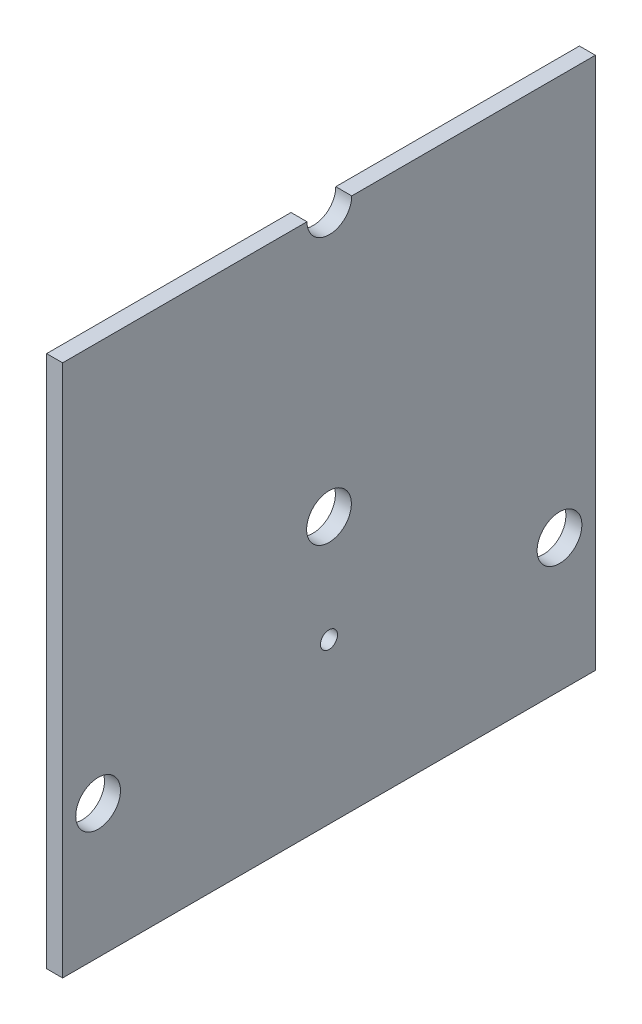
ISO-10303-21;
HEADER;
FILE_DESCRIPTION(('STEP AP214'),'2;1');
FILE_NAME('part.step','',(''),(''),'','','');
FILE_SCHEMA(('AUTOMOTIVE_DESIGN { 1 0 10303 214 1 1 1 1 }'));
ENDSEC;
DATA;
#1=APPLICATION_CONTEXT('core data for automotive mechanical design processes');
#2=APPLICATION_PROTOCOL_DEFINITION('international standard','automotive_design',2000,#1);
#3=PRODUCT_CONTEXT('',#1,'mechanical');
#4=PRODUCT('Part','Part','',(#3));
#5=PRODUCT_RELATED_PRODUCT_CATEGORY('part','',(#4));
#6=PRODUCT_DEFINITION_FORMATION('','',#4);
#7=PRODUCT_DEFINITION_CONTEXT('part definition',#1,'design');
#8=PRODUCT_DEFINITION('design','',#6,#7);
#9=PRODUCT_DEFINITION_SHAPE('','',#8);
#10=(LENGTH_UNIT() NAMED_UNIT(*) SI_UNIT(.MILLI.,.METRE.));
#11=(NAMED_UNIT(*) PLANE_ANGLE_UNIT() SI_UNIT($,.RADIAN.));
#12=(NAMED_UNIT(*) SI_UNIT($,.STERADIAN.) SOLID_ANGLE_UNIT());
#13=UNCERTAINTY_MEASURE_WITH_UNIT(LENGTH_MEASURE(1.E-05),#10,'distance_accuracy_value','');
#14=(GEOMETRIC_REPRESENTATION_CONTEXT(3) GLOBAL_UNCERTAINTY_ASSIGNED_CONTEXT((#13)) GLOBAL_UNIT_ASSIGNED_CONTEXT((#10,
#11,#12)) REPRESENTATION_CONTEXT('',''));
#15=CARTESIAN_POINT('',(0.,0.,0.));
#16=DIRECTION('',(0.,0.,1.));
#17=DIRECTION('',(1.,0.,0.));
#18=AXIS2_PLACEMENT_3D('',#15,#16,#17);
#19=CARTESIAN_POINT('',(3.,50.,50.));
#20=DIRECTION('',(0.,-1.,0.));
#21=DIRECTION('',(0.,0.,-1.));
#22=AXIS2_PLACEMENT_3D('',#19,#20,#21);
#23=PLANE('',#22);
#24=DIRECTION('',(0.,0.,1.));
#25=VECTOR('',#24,1.);
#26=CARTESIAN_POINT('',(3.,50.,50.));
#27=LINE('',#26,#25);
#28=CARTESIAN_POINT('',(3.,50.,4.12849793611253));
#29=VERTEX_POINT('',#28);
#30=CARTESIAN_POINT('',(3.,50.,50.));
#31=VERTEX_POINT('',#30);
#32=EDGE_CURVE('E56',#29,#31,#27,.T.);
#33=ORIENTED_EDGE('',*,*,#32,.F.);
#34=DIRECTION('',(-1.,0.,0.));
#35=VECTOR('',#34,1.);
#36=CARTESIAN_POINT('',(10.,50.,4.12849793611253));
#37=LINE('',#36,#35);
#38=CARTESIAN_POINT('',(0.,50.,4.12849793611253));
#39=VERTEX_POINT('',#38);
#40=EDGE_CURVE('E11',#29,#39,#37,.T.);
#41=ORIENTED_EDGE('',*,*,#40,.T.);
#42=DIRECTION('',(0.,0.,1.));
#43=VECTOR('',#42,1.);
#44=CARTESIAN_POINT('',(0.,50.,50.));
#45=LINE('',#44,#43);
#46=CARTESIAN_POINT('',(0.,50.,50.));
#47=VERTEX_POINT('',#46);
#48=EDGE_CURVE('E77',#39,#47,#45,.T.);
#49=ORIENTED_EDGE('',*,*,#48,.T.);
#50=DIRECTION('',(-1.,0.,0.));
#51=VECTOR('',#50,1.);
#52=CARTESIAN_POINT('',(3.,50.,50.));
#53=LINE('',#52,#51);
#54=EDGE_CURVE('E114',#31,#47,#53,.T.);
#55=ORIENTED_EDGE('',*,*,#54,.F.);
#56=EDGE_LOOP('',(#33,#41,#49,#55));
#57=FACE_BOUND('',#56,.T.);
#58=ADVANCED_FACE('F33',(#57),#23,.F.);
#59=CARTESIAN_POINT('',(3.,0.,0.));
#60=DIRECTION('',(1.,0.,0.));
#61=DIRECTION('',(0.,0.,-1.));
#62=AXIS2_PLACEMENT_3D('',#59,#60,#61);
#63=PLANE('',#62);
#64=CARTESIAN_POINT('',(3.,-20.,0.));
#65=DIRECTION('',(1.,0.,0.));
#66=DIRECTION('',(0.,0.,-1.));
#67=AXIS2_PLACEMENT_3D('',#64,#65,#66);
#68=CIRCLE('',#67,1.6);
#69=CARTESIAN_POINT('',(3.,-20.,-1.6));
#70=VERTEX_POINT('',#69);
#71=EDGE_CURVE('E99',#70,#70,#68,.T.);
#72=ORIENTED_EDGE('',*,*,#71,.F.);
#73=EDGE_LOOP('',(#72));
#74=FACE_BOUND('',#73,.T.);
#75=CARTESIAN_POINT('',(3.,-25.0618970407415,-43.2654748814718));
#76=DIRECTION('',(1.,0.,0.));
#77=DIRECTION('',(0.,0.,-1.));
#78=AXIS2_PLACEMENT_3D('',#75,#76,#77);
#79=CIRCLE('',#78,4.2);
#80=CARTESIAN_POINT('',(3.,-25.0618970407415,-47.4654748814718));
#81=VERTEX_POINT('',#80);
#82=EDGE_CURVE('E156',#81,#81,#79,.T.);
#83=ORIENTED_EDGE('',*,*,#82,.F.);
#84=EDGE_LOOP('',(#83));
#85=FACE_BOUND('',#84,.T.);
#86=CARTESIAN_POINT('',(3.,49.9999488745229,-0.0715020635763067));
#87=DIRECTION('',(1.,0.,0.));
#88=DIRECTION('',(0.,0.,-1.));
#89=AXIS2_PLACEMENT_3D('',#86,#87,#88);
#90=CIRCLE('',#89,4.2);
#91=CARTESIAN_POINT('',(3.,50.,-4.27150206326514));
#92=VERTEX_POINT('',#91);
#93=EDGE_CURVE('E48',#29,#92,#90,.T.);
#94=ORIENTED_EDGE('',*,*,#93,.F.);
#95=ORIENTED_EDGE('',*,*,#32,.T.);
#96=DIRECTION('',(0.,-1.,0.));
#97=VECTOR('',#96,1.);
#98=CARTESIAN_POINT('',(3.,50.,50.));
#99=LINE('',#98,#97);
#100=CARTESIAN_POINT('',(3.,-50.,50.));
#101=VERTEX_POINT('',#100);
#102=EDGE_CURVE('E109',#31,#101,#99,.T.);
#103=ORIENTED_EDGE('',*,*,#102,.T.);
#104=DIRECTION('',(0.,0.,-1.));
#105=VECTOR('',#104,1.);
#106=CARTESIAN_POINT('',(3.,-50.,50.));
#107=LINE('',#106,#105);
#108=CARTESIAN_POINT('',(3.,-50.,-50.));
#109=VERTEX_POINT('',#108);
#110=EDGE_CURVE('E85',#101,#109,#107,.T.);
#111=ORIENTED_EDGE('',*,*,#110,.T.);
#112=DIRECTION('',(0.,1.,0.));
#113=VECTOR('',#112,1.);
#114=CARTESIAN_POINT('',(3.,50.,-50.));
#115=LINE('',#114,#113);
#116=CARTESIAN_POINT('',(3.,50.,-50.));
#117=VERTEX_POINT('',#116);
#118=EDGE_CURVE('E131',#109,#117,#115,.T.);
#119=ORIENTED_EDGE('',*,*,#118,.T.);
#120=EDGE_CURVE('E117',#117,#92,#27,.T.);
#121=ORIENTED_EDGE('',*,*,#120,.T.);
#122=EDGE_LOOP('',(#94,#95,#103,#111,#119,#121));
#123=FACE_BOUND('',#122,.T.);
#124=CARTESIAN_POINT('',(3.,-24.9380518337814,43.3369769450481));
#125=DIRECTION('',(1.,0.,0.));
#126=DIRECTION('',(0.,0.,-1.));
#127=AXIS2_PLACEMENT_3D('',#124,#125,#126);
#128=CIRCLE('',#127,4.2);
#129=CARTESIAN_POINT('',(3.,-24.9380518337814,39.1369769450481));
#130=VERTEX_POINT('',#129);
#131=EDGE_CURVE('E148',#130,#130,#128,.T.);
#132=ORIENTED_EDGE('',*,*,#131,.F.);
#133=EDGE_LOOP('',(#132));
#134=FACE_BOUND('',#133,.T.);
#135=CARTESIAN_POINT('',(3.,0.,0.));
#136=DIRECTION('',(1.,0.,0.));
#137=DIRECTION('',(0.,0.,-1.));
#138=AXIS2_PLACEMENT_3D('',#135,#136,#137);
#139=CIRCLE('',#138,4.2);
#140=CARTESIAN_POINT('',(3.,0.,-4.2));
#141=VERTEX_POINT('',#140);
#142=EDGE_CURVE('E137',#141,#141,#139,.T.);
#143=ORIENTED_EDGE('',*,*,#142,.F.);
#144=EDGE_LOOP('',(#143));
#145=FACE_BOUND('',#144,.T.);
#146=ADVANCED_FACE('F128',(#74,#85,#123,#134,#145),#63,.T.);
#147=CARTESIAN_POINT('',(0.,0.,0.));
#148=DIRECTION('',(1.,0.,0.));
#149=DIRECTION('',(0.,0.,-1.));
#150=AXIS2_PLACEMENT_3D('',#147,#148,#149);
#151=PLANE('',#150);
#152=CARTESIAN_POINT('',(0.,-20.,0.));
#153=DIRECTION('',(-1.,0.,0.));
#154=DIRECTION('',(0.,0.,1.));
#155=AXIS2_PLACEMENT_3D('',#152,#153,#154);
#156=CIRCLE('',#155,1.6);
#157=CARTESIAN_POINT('',(0.,-20.,1.6));
#158=VERTEX_POINT('',#157);
#159=EDGE_CURVE('E164',#158,#158,#156,.T.);
#160=ORIENTED_EDGE('',*,*,#159,.F.);
#161=EDGE_LOOP('',(#160));
#162=FACE_BOUND('',#161,.T.);
#163=CARTESIAN_POINT('',(0.,-25.0618970407415,-43.2654748814718));
#164=DIRECTION('',(-1.,0.,0.));
#165=DIRECTION('',(0.,0.,1.));
#166=AXIS2_PLACEMENT_3D('',#163,#164,#165);
#167=CIRCLE('',#166,4.2);
#168=CARTESIAN_POINT('',(0.,-25.0618970407415,-39.0654748814718));
#169=VERTEX_POINT('',#168);
#170=EDGE_CURVE('E98',#169,#169,#167,.T.);
#171=ORIENTED_EDGE('',*,*,#170,.F.);
#172=EDGE_LOOP('',(#171));
#173=FACE_BOUND('',#172,.T.);
#174=CARTESIAN_POINT('',(0.,-24.9380518337814,43.3369769450481));
#175=DIRECTION('',(-1.,0.,0.));
#176=DIRECTION('',(0.,0.,1.));
#177=AXIS2_PLACEMENT_3D('',#174,#175,#176);
#178=CIRCLE('',#177,4.2);
#179=CARTESIAN_POINT('',(0.,-24.9380518337814,47.5369769450481));
#180=VERTEX_POINT('',#179);
#181=EDGE_CURVE('E153',#180,#180,#178,.T.);
#182=ORIENTED_EDGE('',*,*,#181,.F.);
#183=EDGE_LOOP('',(#182));
#184=FACE_BOUND('',#183,.T.);
#185=ORIENTED_EDGE('',*,*,#48,.F.);
#186=CARTESIAN_POINT('',(0.,49.9999488745229,-0.0715020635763067));
#187=DIRECTION('',(-1.,0.,0.));
#188=DIRECTION('',(0.,0.,1.));
#189=AXIS2_PLACEMENT_3D('',#186,#187,#188);
#190=CIRCLE('',#189,4.2);
#191=CARTESIAN_POINT('',(0.,50.,-4.27150206326514));
#192=VERTEX_POINT('',#191);
#193=EDGE_CURVE('E93',#192,#39,#190,.T.);
#194=ORIENTED_EDGE('',*,*,#193,.F.);
#195=CARTESIAN_POINT('',(0.,50.,-50.));
#196=VERTEX_POINT('',#195);
#197=EDGE_CURVE('E106',#196,#192,#45,.T.);
#198=ORIENTED_EDGE('',*,*,#197,.F.);
#199=DIRECTION('',(0.,1.,0.));
#200=VECTOR('',#199,1.);
#201=CARTESIAN_POINT('',(0.,50.,-50.));
#202=LINE('',#201,#200);
#203=CARTESIAN_POINT('',(0.,-50.,-50.));
#204=VERTEX_POINT('',#203);
#205=EDGE_CURVE('E107',#204,#196,#202,.T.);
#206=ORIENTED_EDGE('',*,*,#205,.F.);
#207=DIRECTION('',(0.,0.,-1.));
#208=VECTOR('',#207,1.);
#209=CARTESIAN_POINT('',(0.,-50.,50.));
#210=LINE('',#209,#208);
#211=CARTESIAN_POINT('',(0.,-50.,50.));
#212=VERTEX_POINT('',#211);
#213=EDGE_CURVE('E110',#212,#204,#210,.T.);
#214=ORIENTED_EDGE('',*,*,#213,.F.);
#215=DIRECTION('',(0.,-1.,0.));
#216=VECTOR('',#215,1.);
#217=CARTESIAN_POINT('',(0.,50.,50.));
#218=LINE('',#217,#216);
#219=EDGE_CURVE('E105',#47,#212,#218,.T.);
#220=ORIENTED_EDGE('',*,*,#219,.F.);
#221=EDGE_LOOP('',(#185,#194,#198,#206,#214,#220));
#222=FACE_BOUND('',#221,.T.);
#223=CARTESIAN_POINT('',(0.,0.,0.));
#224=DIRECTION('',(1.,0.,0.));
#225=DIRECTION('',(0.,0.,-1.));
#226=AXIS2_PLACEMENT_3D('',#223,#224,#225);
#227=CIRCLE('',#226,4.2);
#228=CARTESIAN_POINT('',(0.,0.,-4.2));
#229=VERTEX_POINT('',#228);
#230=EDGE_CURVE('E145',#229,#229,#227,.T.);
#231=ORIENTED_EDGE('',*,*,#230,.T.);
#232=EDGE_LOOP('',(#231));
#233=FACE_BOUND('',#232,.T.);
#234=ADVANCED_FACE('F102',(#162,#173,#184,#222,#233),#151,.F.);
#235=CARTESIAN_POINT('',(3.,50.,50.));
#236=DIRECTION('',(0.,0.,-1.));
#237=DIRECTION('',(-1.,0.,0.));
#238=AXIS2_PLACEMENT_3D('',#235,#236,#237);
#239=PLANE('',#238);
#240=ORIENTED_EDGE('',*,*,#219,.T.);
#241=DIRECTION('',(-1.,0.,0.));
#242=VECTOR('',#241,1.);
#243=CARTESIAN_POINT('',(3.,-50.,50.));
#244=LINE('',#243,#242);
#245=EDGE_CURVE('E123',#101,#212,#244,.T.);
#246=ORIENTED_EDGE('',*,*,#245,.F.);
#247=ORIENTED_EDGE('',*,*,#102,.F.);
#248=ORIENTED_EDGE('',*,*,#54,.T.);
#249=EDGE_LOOP('',(#240,#246,#247,#248));
#250=FACE_BOUND('',#249,.T.);
#251=ADVANCED_FACE('F35',(#250),#239,.F.);
#252=CARTESIAN_POINT('',(3.,-50.,50.));
#253=DIRECTION('',(0.,1.,0.));
#254=DIRECTION('',(0.,0.,1.));
#255=AXIS2_PLACEMENT_3D('',#252,#253,#254);
#256=PLANE('',#255);
#257=ORIENTED_EDGE('',*,*,#213,.T.);
#258=DIRECTION('',(-1.,0.,0.));
#259=VECTOR('',#258,1.);
#260=CARTESIAN_POINT('',(3.,-50.,-50.));
#261=LINE('',#260,#259);
#262=EDGE_CURVE('E120',#109,#204,#261,.T.);
#263=ORIENTED_EDGE('',*,*,#262,.F.);
#264=ORIENTED_EDGE('',*,*,#110,.F.);
#265=ORIENTED_EDGE('',*,*,#245,.T.);
#266=EDGE_LOOP('',(#257,#263,#264,#265));
#267=FACE_BOUND('',#266,.T.);
#268=ADVANCED_FACE('F138',(#267),#256,.F.);
#269=CARTESIAN_POINT('',(3.,50.,-50.));
#270=DIRECTION('',(0.,0.,1.));
#271=DIRECTION('',(1.,0.,0.));
#272=AXIS2_PLACEMENT_3D('',#269,#270,#271);
#273=PLANE('',#272);
#274=ORIENTED_EDGE('',*,*,#205,.T.);
#275=DIRECTION('',(-1.,0.,0.));
#276=VECTOR('',#275,1.);
#277=CARTESIAN_POINT('',(3.,50.,-50.));
#278=LINE('',#277,#276);
#279=EDGE_CURVE('E116',#117,#196,#278,.T.);
#280=ORIENTED_EDGE('',*,*,#279,.F.);
#281=ORIENTED_EDGE('',*,*,#118,.F.);
#282=ORIENTED_EDGE('',*,*,#262,.T.);
#283=EDGE_LOOP('',(#274,#280,#281,#282));
#284=FACE_BOUND('',#283,.T.);
#285=ADVANCED_FACE('F142',(#284),#273,.F.);
#286=ORIENTED_EDGE('',*,*,#197,.T.);
#287=DIRECTION('',(-1.,0.,0.));
#288=VECTOR('',#287,1.);
#289=CARTESIAN_POINT('',(10.,50.,-4.27150206326514));
#290=LINE('',#289,#288);
#291=EDGE_CURVE('E41',#192,#92,#290,.F.);
#292=ORIENTED_EDGE('',*,*,#291,.T.);
#293=ORIENTED_EDGE('',*,*,#120,.F.);
#294=ORIENTED_EDGE('',*,*,#279,.T.);
#295=EDGE_LOOP('',(#286,#292,#293,#294));
#296=FACE_BOUND('',#295,.T.);
#297=ADVANCED_FACE('F127',(#296),#23,.F.);
#298=CARTESIAN_POINT('',(3.,0.,0.));
#299=DIRECTION('',(-1.,0.,0.));
#300=DIRECTION('',(0.,0.,1.));
#301=AXIS2_PLACEMENT_3D('',#298,#299,#300);
#302=CYLINDRICAL_SURFACE('',#301,4.2);
#303=ORIENTED_EDGE('',*,*,#142,.T.);
#304=EDGE_LOOP('',(#303));
#305=FACE_BOUND('',#304,.T.);
#306=ORIENTED_EDGE('',*,*,#230,.F.);
#307=EDGE_LOOP('',(#306));
#308=FACE_BOUND('',#307,.T.);
#309=ADVANCED_FACE('F179',(#305,#308),#302,.F.);
#310=CARTESIAN_POINT('',(10.,-24.9380518337814,43.3369769450481));
#311=DIRECTION('',(-1.,0.,0.));
#312=DIRECTION('',(0.,0.,1.));
#313=AXIS2_PLACEMENT_3D('',#310,#311,#312);
#314=CYLINDRICAL_SURFACE('',#313,4.2);
#315=ORIENTED_EDGE('',*,*,#131,.T.);
#316=EDGE_LOOP('',(#315));
#317=FACE_BOUND('',#316,.T.);
#318=ORIENTED_EDGE('',*,*,#181,.T.);
#319=EDGE_LOOP('',(#318));
#320=FACE_BOUND('',#319,.T.);
#321=ADVANCED_FACE('F177',(#317,#320),#314,.F.);
#322=CARTESIAN_POINT('',(10.,49.9999488745229,-0.0715020635763067));
#323=DIRECTION('',(-1.,0.,0.));
#324=DIRECTION('',(0.,0.,1.));
#325=AXIS2_PLACEMENT_3D('',#322,#323,#324);
#326=CYLINDRICAL_SURFACE('',#325,4.2);
#327=ORIENTED_EDGE('',*,*,#93,.T.);
#328=ORIENTED_EDGE('',*,*,#291,.F.);
#329=ORIENTED_EDGE('',*,*,#193,.T.);
#330=ORIENTED_EDGE('',*,*,#40,.F.);
#331=EDGE_LOOP('',(#327,#328,#329,#330));
#332=FACE_BOUND('',#331,.T.);
#333=ADVANCED_FACE('F94',(#332),#326,.F.);
#334=CARTESIAN_POINT('',(10.,-25.0618970407415,-43.2654748814718));
#335=DIRECTION('',(-1.,0.,0.));
#336=DIRECTION('',(0.,0.,1.));
#337=AXIS2_PLACEMENT_3D('',#334,#335,#336);
#338=CYLINDRICAL_SURFACE('',#337,4.2);
#339=ORIENTED_EDGE('',*,*,#82,.T.);
#340=EDGE_LOOP('',(#339));
#341=FACE_BOUND('',#340,.T.);
#342=ORIENTED_EDGE('',*,*,#170,.T.);
#343=EDGE_LOOP('',(#342));
#344=FACE_BOUND('',#343,.T.);
#345=ADVANCED_FACE('F186',(#341,#344),#338,.F.);
#346=CARTESIAN_POINT('',(10.,-20.,0.));
#347=DIRECTION('',(-1.,0.,0.));
#348=DIRECTION('',(0.,0.,1.));
#349=AXIS2_PLACEMENT_3D('',#346,#347,#348);
#350=CYLINDRICAL_SURFACE('',#349,1.6);
#351=ORIENTED_EDGE('',*,*,#71,.T.);
#352=EDGE_LOOP('',(#351));
#353=FACE_BOUND('',#352,.T.);
#354=ORIENTED_EDGE('',*,*,#159,.T.);
#355=EDGE_LOOP('',(#354));
#356=FACE_BOUND('',#355,.T.);
#357=ADVANCED_FACE('F168',(#353,#356),#350,.F.);
#358=CLOSED_SHELL('',(#58,#146,#234,#251,#268,#285,#297,#309,#321,#333,#345,#357));
#359=MANIFOLD_SOLID_BREP('B2',#358);
#360=ADVANCED_BREP_SHAPE_REPRESENTATION('',(#18,#359),#14);
#361=SHAPE_DEFINITION_REPRESENTATION(#9,#360);
ENDSEC;
END-ISO-10303-21;
